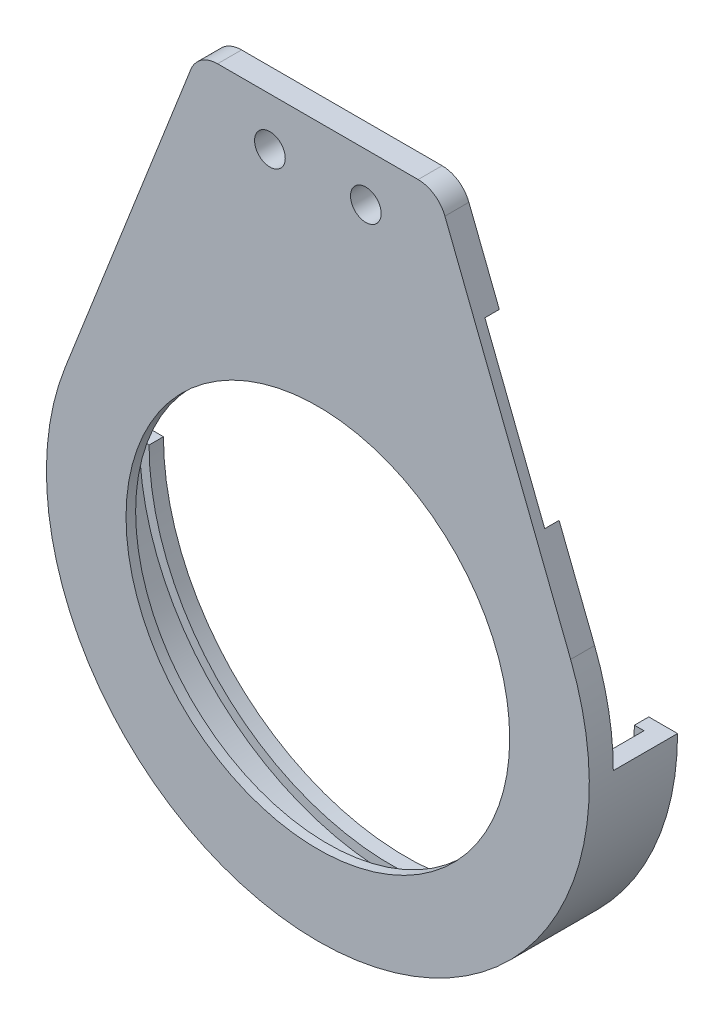
ISO-10303-21;
HEADER;
FILE_DESCRIPTION(('STEP AP214'),'2;1');
FILE_NAME('part.step','',(''),(''),'','','');
FILE_SCHEMA(('AUTOMOTIVE_DESIGN { 1 0 10303 214 1 1 1 1 }'));
ENDSEC;
DATA;
#1=APPLICATION_CONTEXT('core data for automotive mechanical design processes');
#2=APPLICATION_PROTOCOL_DEFINITION('international standard','automotive_design',2000,#1);
#3=PRODUCT_CONTEXT('',#1,'mechanical');
#4=PRODUCT('Part','Part','',(#3));
#5=PRODUCT_RELATED_PRODUCT_CATEGORY('part','',(#4));
#6=PRODUCT_DEFINITION_FORMATION('','',#4);
#7=PRODUCT_DEFINITION_CONTEXT('part definition',#1,'design');
#8=PRODUCT_DEFINITION('design','',#6,#7);
#9=PRODUCT_DEFINITION_SHAPE('','',#8);
#10=(LENGTH_UNIT() NAMED_UNIT(*) SI_UNIT(.MILLI.,.METRE.));
#11=(NAMED_UNIT(*) PLANE_ANGLE_UNIT() SI_UNIT($,.RADIAN.));
#12=(NAMED_UNIT(*) SI_UNIT($,.STERADIAN.) SOLID_ANGLE_UNIT());
#13=UNCERTAINTY_MEASURE_WITH_UNIT(LENGTH_MEASURE(1.E-05),#10,'distance_accuracy_value','');
#14=(GEOMETRIC_REPRESENTATION_CONTEXT(3) GLOBAL_UNCERTAINTY_ASSIGNED_CONTEXT((#13)) GLOBAL_UNIT_ASSIGNED_CONTEXT((#10,
#11,#12)) REPRESENTATION_CONTEXT('',''));
#15=CARTESIAN_POINT('',(0.,0.,0.));
#16=DIRECTION('',(0.,0.,1.));
#17=DIRECTION('',(1.,0.,0.));
#18=AXIS2_PLACEMENT_3D('',#15,#16,#17);
#19=CARTESIAN_POINT('',(0.,0.,0.));
#20=DIRECTION('',(0.,0.,1.));
#21=DIRECTION('',(1.,0.,0.));
#22=AXIS2_PLACEMENT_3D('',#19,#20,#21);
#23=PLANE('',#22);
#24=DIRECTION('',(-0.364610341829542,-0.931160189565117,0.));
#25=VECTOR('',#24,1.);
#26=CARTESIAN_POINT('',(-26.3518333646928,10.318472673776,0.));
#27=LINE('',#26,#25);
#28=CARTESIAN_POINT('',(-22.65,19.7724005034407,0.));
#29=VERTEX_POINT('',#28);
#30=CARTESIAN_POINT('',(-26.3518333646928,10.318472673776,0.));
#31=VERTEX_POINT('',#30);
#32=EDGE_CURVE('E281',#29,#31,#27,.T.);
#33=ORIENTED_EDGE('',*,*,#32,.F.);
#34=DIRECTION('',(0.,-1.,0.));
#35=VECTOR('',#34,1.);
#36=CARTESIAN_POINT('',(-22.65,0.,0.));
#37=LINE('',#36,#35);
#38=CARTESIAN_POINT('',(-22.65,0.,0.));
#39=VERTEX_POINT('',#38);
#40=EDGE_CURVE('E211',#29,#39,#37,.T.);
#41=ORIENTED_EDGE('',*,*,#40,.T.);
#42=CARTESIAN_POINT('',(0.,0.,0.));
#43=DIRECTION('',(0.,0.,1.));
#44=DIRECTION('',(1.,0.,0.));
#45=AXIS2_PLACEMENT_3D('',#42,#43,#44);
#46=CIRCLE('',#45,22.65);
#47=CARTESIAN_POINT('',(22.65,0.,0.));
#48=VERTEX_POINT('',#47);
#49=EDGE_CURVE('E315',#39,#48,#46,.T.);
#50=ORIENTED_EDGE('',*,*,#49,.T.);
#51=DIRECTION('',(0.,1.,0.));
#52=VECTOR('',#51,1.);
#53=CARTESIAN_POINT('',(22.65,0.,0.));
#54=LINE('',#53,#52);
#55=CARTESIAN_POINT('',(22.65,19.7724005034407,0.));
#56=VERTEX_POINT('',#55);
#57=EDGE_CURVE('E186',#48,#56,#54,.T.);
#58=ORIENTED_EDGE('',*,*,#57,.T.);
#59=DIRECTION('',(-0.364610341829542,0.931160189565117,0.));
#60=VECTOR('',#59,1.);
#61=CARTESIAN_POINT('',(26.3518333646928,10.318472673776,0.));
#62=LINE('',#61,#60);
#63=CARTESIAN_POINT('',(26.3518333646928,10.318472673776,0.));
#64=VERTEX_POINT('',#63);
#65=EDGE_CURVE('E274',#64,#56,#62,.T.);
#66=ORIENTED_EDGE('',*,*,#65,.F.);
#67=CARTESIAN_POINT('',(0.,0.,0.));
#68=DIRECTION('',(0.,0.,1.));
#69=DIRECTION('',(1.,0.,0.));
#70=AXIS2_PLACEMENT_3D('',#67,#68,#69);
#71=CIRCLE('',#70,28.3);
#72=CARTESIAN_POINT('',(28.3,0.,0.));
#73=VERTEX_POINT('',#72);
#74=EDGE_CURVE('E300',#73,#64,#71,.T.);
#75=ORIENTED_EDGE('',*,*,#74,.F.);
#76=DIRECTION('',(1.,0.,0.));
#77=VECTOR('',#76,1.);
#78=CARTESIAN_POINT('',(28.3,0.,0.));
#79=LINE('',#78,#77);
#80=CARTESIAN_POINT('',(26.3,0.,0.));
#81=VERTEX_POINT('',#80);
#82=EDGE_CURVE('E242',#81,#73,#79,.T.);
#83=ORIENTED_EDGE('',*,*,#82,.F.);
#84=CARTESIAN_POINT('',(0.,0.,0.));
#85=DIRECTION('',(0.,0.,1.));
#86=DIRECTION('',(-1.,0.,0.));
#87=AXIS2_PLACEMENT_3D('',#84,#85,#86);
#88=CIRCLE('',#87,26.3);
#89=CARTESIAN_POINT('',(-26.3,0.,0.));
#90=VERTEX_POINT('',#89);
#91=EDGE_CURVE('E245',#90,#81,#88,.T.);
#92=ORIENTED_EDGE('',*,*,#91,.F.);
#93=DIRECTION('',(1.,0.,0.));
#94=VECTOR('',#93,1.);
#95=CARTESIAN_POINT('',(-28.3,0.,0.));
#96=LINE('',#95,#94);
#97=CARTESIAN_POINT('',(-28.3,0.,0.));
#98=VERTEX_POINT('',#97);
#99=EDGE_CURVE('E237',#98,#90,#96,.T.);
#100=ORIENTED_EDGE('',*,*,#99,.F.);
#101=EDGE_CURVE('E304',#31,#98,#71,.T.);
#102=ORIENTED_EDGE('',*,*,#101,.F.);
#103=EDGE_LOOP('',(#33,#41,#50,#58,#66,#75,#83,#92,#100,#102));
#104=FACE_BOUND('',#103,.T.);
#105=ADVANCED_FACE('F42',(#104),#23,.F.);
#106=CARTESIAN_POINT('',(0.,0.,2.5));
#107=DIRECTION('',(0.,0.,-1.));
#108=DIRECTION('',(-1.,0.,0.));
#109=AXIS2_PLACEMENT_3D('',#106,#107,#108);
#110=CYLINDRICAL_SURFACE('',#109,20.);
#111=CARTESIAN_POINT('',(0.,0.,2.5));
#112=DIRECTION('',(0.,0.,1.));
#113=DIRECTION('',(1.,0.,0.));
#114=AXIS2_PLACEMENT_3D('',#111,#112,#113);
#115=CIRCLE('',#114,20.);
#116=CARTESIAN_POINT('',(20.,0.,2.5));
#117=VERTEX_POINT('',#116);
#118=EDGE_CURVE('E295',#117,#117,#115,.T.);
#119=ORIENTED_EDGE('',*,*,#118,.T.);
#120=EDGE_LOOP('',(#119));
#121=FACE_BOUND('',#120,.T.);
#122=CARTESIAN_POINT('',(0.,0.,1.5));
#123=DIRECTION('',(0.,0.,-1.));
#124=DIRECTION('',(-1.,0.,0.));
#125=AXIS2_PLACEMENT_3D('',#122,#123,#124);
#126=CIRCLE('',#125,20.);
#127=CARTESIAN_POINT('',(-20.,0.,1.5));
#128=VERTEX_POINT('',#127);
#129=EDGE_CURVE('E201',#128,#128,#126,.T.);
#130=ORIENTED_EDGE('',*,*,#129,.T.);
#131=EDGE_LOOP('',(#130));
#132=FACE_BOUND('',#131,.T.);
#133=ADVANCED_FACE('F359',(#121,#132),#110,.F.);
#134=CARTESIAN_POINT('',(-5.,40.6939798987516,0.));
#135=DIRECTION('',(0.,0.,1.));
#136=DIRECTION('',(1.,0.,0.));
#137=AXIS2_PLACEMENT_3D('',#134,#135,#136);
#138=CIRCLE('',#137,1.6);
#139=CARTESIAN_POINT('',(-3.4,40.6939798987516,0.));
#140=VERTEX_POINT('',#139);
#141=EDGE_CURVE('E268',#140,#140,#138,.T.);
#142=ORIENTED_EDGE('',*,*,#141,.T.);
#143=EDGE_LOOP('',(#142));
#144=FACE_BOUND('',#143,.T.);
#145=CARTESIAN_POINT('',(5.,40.6939798987516,0.));
#146=DIRECTION('',(0.,0.,1.));
#147=DIRECTION('',(-1.,0.,0.));
#148=AXIS2_PLACEMENT_3D('',#145,#146,#147);
#149=CIRCLE('',#148,1.59999999999999);
#150=CARTESIAN_POINT('',(3.40000000000001,40.6939798987516,0.));
#151=VERTEX_POINT('',#150);
#152=EDGE_CURVE('E262',#151,#151,#149,.T.);
#153=ORIENTED_EDGE('',*,*,#152,.T.);
#154=EDGE_LOOP('',(#153));
#155=FACE_BOUND('',#154,.T.);
#156=CARTESIAN_POINT('',(-13.2463902872674,43.7878109242402,0.));
#157=VERTEX_POINT('',#156);
#158=CARTESIAN_POINT('',(-16.4156564672275,35.6939798987516,0.));
#159=VERTEX_POINT('',#158);
#160=EDGE_CURVE('E282',#157,#159,#27,.T.);
#161=ORIENTED_EDGE('',*,*,#160,.F.);
#162=CARTESIAN_POINT('',(-10.452909718572,42.6939798987516,0.));
#163=DIRECTION('',(0.,0.,1.));
#164=DIRECTION('',(1.,0.,0.));
#165=AXIS2_PLACEMENT_3D('',#162,#163,#164);
#166=CIRCLE('',#165,3.);
#167=CARTESIAN_POINT('',(-10.452909718572,45.6939798987516,0.));
#168=VERTEX_POINT('',#167);
#169=EDGE_CURVE('E50',#157,#168,#166,.F.);
#170=ORIENTED_EDGE('',*,*,#169,.T.);
#171=DIRECTION('',(-1.,0.,0.));
#172=VECTOR('',#171,1.);
#173=CARTESIAN_POINT('',(-12.5,45.6939798987516,0.));
#174=LINE('',#173,#172);
#175=CARTESIAN_POINT('',(10.452909718572,45.6939798987516,0.));
#176=VERTEX_POINT('',#175);
#177=EDGE_CURVE('E277',#176,#168,#174,.T.);
#178=ORIENTED_EDGE('',*,*,#177,.F.);
#179=CARTESIAN_POINT('',(10.452909718572,42.6939798987516,0.));
#180=DIRECTION('',(0.,0.,1.));
#181=DIRECTION('',(1.,0.,0.));
#182=AXIS2_PLACEMENT_3D('',#179,#180,#181);
#183=CIRCLE('',#182,3.);
#184=CARTESIAN_POINT('',(13.2463902872674,43.7878109242402,0.));
#185=VERTEX_POINT('',#184);
#186=EDGE_CURVE('E57',#176,#185,#183,.F.);
#187=ORIENTED_EDGE('',*,*,#186,.T.);
#188=CARTESIAN_POINT('',(16.4156564672275,35.6939798987516,0.));
#189=VERTEX_POINT('',#188);
#190=EDGE_CURVE('E278',#189,#185,#62,.T.);
#191=ORIENTED_EDGE('',*,*,#190,.F.);
#192=DIRECTION('',(-1.,0.,0.));
#193=VECTOR('',#192,1.);
#194=CARTESIAN_POINT('',(0.,35.6939798987516,0.));
#195=LINE('',#194,#193);
#196=EDGE_CURVE('E204',#189,#159,#195,.T.);
#197=ORIENTED_EDGE('',*,*,#196,.T.);
#198=EDGE_LOOP('',(#161,#170,#178,#187,#191,#197));
#199=FACE_BOUND('',#198,.T.);
#200=ADVANCED_FACE('F328',(#144,#155,#199),#23,.F.);
#201=CARTESIAN_POINT('',(0.,0.,2.5));
#202=DIRECTION('',(0.,0.,1.));
#203=DIRECTION('',(1.,0.,0.));
#204=AXIS2_PLACEMENT_3D('',#201,#202,#203);
#205=PLANE('',#204);
#206=DIRECTION('',(-1.,0.,0.));
#207=VECTOR('',#206,1.);
#208=CARTESIAN_POINT('',(-12.5,45.6939798987516,2.5));
#209=LINE('',#208,#207);
#210=CARTESIAN_POINT('',(10.452909718572,45.6939798987516,2.5));
#211=VERTEX_POINT('',#210);
#212=CARTESIAN_POINT('',(-10.452909718572,45.6939798987516,2.5));
#213=VERTEX_POINT('',#212);
#214=EDGE_CURVE('E287',#211,#213,#209,.T.);
#215=ORIENTED_EDGE('',*,*,#214,.T.);
#216=CARTESIAN_POINT('',(-10.452909718572,42.6939798987516,2.5));
#217=DIRECTION('',(0.,0.,1.));
#218=DIRECTION('',(1.,0.,0.));
#219=AXIS2_PLACEMENT_3D('',#216,#217,#218);
#220=CIRCLE('',#219,3.);
#221=CARTESIAN_POINT('',(-13.2463902872674,43.7878109242402,2.5));
#222=VERTEX_POINT('',#221);
#223=EDGE_CURVE('E324',#213,#222,#220,.T.);
#224=ORIENTED_EDGE('',*,*,#223,.T.);
#225=DIRECTION('',(-0.364610341829542,-0.931160189565117,0.));
#226=VECTOR('',#225,1.);
#227=CARTESIAN_POINT('',(-26.3518333646928,10.318472673776,2.5));
#228=LINE('',#227,#226);
#229=CARTESIAN_POINT('',(-26.3518333646928,10.318472673776,2.5));
#230=VERTEX_POINT('',#229);
#231=EDGE_CURVE('E290',#222,#230,#228,.T.);
#232=ORIENTED_EDGE('',*,*,#231,.T.);
#233=CARTESIAN_POINT('',(0.,0.,2.5));
#234=DIRECTION('',(0.,0.,1.));
#235=DIRECTION('',(1.,0.,0.));
#236=AXIS2_PLACEMENT_3D('',#233,#234,#235);
#237=CIRCLE('',#236,28.3);
#238=CARTESIAN_POINT('',(26.3518333646928,10.318472673776,2.5));
#239=VERTEX_POINT('',#238);
#240=EDGE_CURVE('E301',#230,#239,#237,.T.);
#241=ORIENTED_EDGE('',*,*,#240,.T.);
#242=DIRECTION('',(-0.364610341829542,0.931160189565117,0.));
#243=VECTOR('',#242,1.);
#244=CARTESIAN_POINT('',(26.3518333646928,10.318472673776,2.5));
#245=LINE('',#244,#243);
#246=CARTESIAN_POINT('',(13.2463902872674,43.7878109242402,2.5));
#247=VERTEX_POINT('',#246);
#248=EDGE_CURVE('E271',#239,#247,#245,.T.);
#249=ORIENTED_EDGE('',*,*,#248,.T.);
#250=CARTESIAN_POINT('',(10.452909718572,42.6939798987516,2.5));
#251=DIRECTION('',(0.,0.,1.));
#252=DIRECTION('',(1.,0.,0.));
#253=AXIS2_PLACEMENT_3D('',#250,#251,#252);
#254=CIRCLE('',#253,3.);
#255=EDGE_CURVE('E322',#247,#211,#254,.T.);
#256=ORIENTED_EDGE('',*,*,#255,.T.);
#257=EDGE_LOOP('',(#215,#224,#232,#241,#249,#256));
#258=FACE_BOUND('',#257,.T.);
#259=ORIENTED_EDGE('',*,*,#118,.F.);
#260=EDGE_LOOP('',(#259));
#261=FACE_BOUND('',#260,.T.);
#262=CARTESIAN_POINT('',(5.,40.6939798987516,2.5));
#263=DIRECTION('',(0.,0.,1.));
#264=DIRECTION('',(-1.,0.,0.));
#265=AXIS2_PLACEMENT_3D('',#262,#263,#264);
#266=CIRCLE('',#265,1.59999999999999);
#267=CARTESIAN_POINT('',(3.40000000000001,40.6939798987516,2.5));
#268=VERTEX_POINT('',#267);
#269=EDGE_CURVE('E261',#268,#268,#266,.T.);
#270=ORIENTED_EDGE('',*,*,#269,.F.);
#271=EDGE_LOOP('',(#270));
#272=FACE_BOUND('',#271,.T.);
#273=CARTESIAN_POINT('',(-5.,40.6939798987516,2.5));
#274=DIRECTION('',(0.,0.,1.));
#275=DIRECTION('',(1.,0.,0.));
#276=AXIS2_PLACEMENT_3D('',#273,#274,#275);
#277=CIRCLE('',#276,1.6);
#278=CARTESIAN_POINT('',(-3.4,40.6939798987516,2.5));
#279=VERTEX_POINT('',#278);
#280=EDGE_CURVE('E265',#279,#279,#277,.T.);
#281=ORIENTED_EDGE('',*,*,#280,.F.);
#282=EDGE_LOOP('',(#281));
#283=FACE_BOUND('',#282,.T.);
#284=ADVANCED_FACE('F337',(#258,#261,#272,#283),#205,.T.);
#285=CARTESIAN_POINT('',(0.,0.,2.5));
#286=DIRECTION('',(0.,0.,-1.));
#287=DIRECTION('',(-1.,0.,0.));
#288=AXIS2_PLACEMENT_3D('',#285,#286,#287);
#289=CYLINDRICAL_SURFACE('',#288,28.3);
#290=ORIENTED_EDGE('',*,*,#240,.F.);
#291=DIRECTION('',(0.,0.,1.));
#292=VECTOR('',#291,1.);
#293=CARTESIAN_POINT('',(-26.3518333646928,10.318472673776,0.));
#294=LINE('',#293,#292);
#295=EDGE_CURVE('E292',#31,#230,#294,.T.);
#296=ORIENTED_EDGE('',*,*,#295,.F.);
#297=ORIENTED_EDGE('',*,*,#101,.T.);
#298=DIRECTION('',(0.,0.,1.));
#299=VECTOR('',#298,1.);
#300=CARTESIAN_POINT('',(-28.3,0.,-5.2));
#301=LINE('',#300,#299);
#302=CARTESIAN_POINT('',(-28.3,0.,-6.7));
#303=VERTEX_POINT('',#302);
#304=EDGE_CURVE('E258',#303,#98,#301,.T.);
#305=ORIENTED_EDGE('',*,*,#304,.F.);
#306=CARTESIAN_POINT('',(0.,0.,-6.7));
#307=DIRECTION('',(0.,0.,-1.));
#308=DIRECTION('',(-1.,0.,0.));
#309=AXIS2_PLACEMENT_3D('',#306,#307,#308);
#310=CIRCLE('',#309,28.3);
#311=CARTESIAN_POINT('',(28.3,0.,-6.7));
#312=VERTEX_POINT('',#311);
#313=EDGE_CURVE('E215',#312,#303,#310,.T.);
#314=ORIENTED_EDGE('',*,*,#313,.F.);
#315=DIRECTION('',(0.,0.,1.));
#316=VECTOR('',#315,1.);
#317=CARTESIAN_POINT('',(28.3,0.,-5.2));
#318=LINE('',#317,#316);
#319=EDGE_CURVE('E241',#312,#73,#318,.T.);
#320=ORIENTED_EDGE('',*,*,#319,.T.);
#321=ORIENTED_EDGE('',*,*,#74,.T.);
#322=DIRECTION('',(0.,0.,1.));
#323=VECTOR('',#322,1.);
#324=CARTESIAN_POINT('',(26.3518333646928,10.318472673776,0.));
#325=LINE('',#324,#323);
#326=EDGE_CURVE('E284',#64,#239,#325,.T.);
#327=ORIENTED_EDGE('',*,*,#326,.T.);
#328=EDGE_LOOP('',(#290,#296,#297,#305,#314,#320,#321,#327));
#329=FACE_BOUND('',#328,.T.);
#330=ADVANCED_FACE('F346',(#329),#289,.T.);
#331=CARTESIAN_POINT('',(-26.3518333646928,10.318472673776,0.));
#332=DIRECTION('',(-0.931160189565117,0.364610341829542,0.));
#333=DIRECTION('',(-0.364610341829542,-0.931160189565117,0.));
#334=AXIS2_PLACEMENT_3D('',#331,#332,#333);
#335=PLANE('',#334);
#336=ORIENTED_EDGE('',*,*,#231,.F.);
#337=DIRECTION('',(0.,0.,1.));
#338=VECTOR('',#337,1.);
#339=CARTESIAN_POINT('',(-13.2463902872674,43.7878109242402,0.));
#340=LINE('',#339,#338);
#341=EDGE_CURVE('E65',#222,#157,#340,.F.);
#342=ORIENTED_EDGE('',*,*,#341,.T.);
#343=ORIENTED_EDGE('',*,*,#160,.T.);
#344=DIRECTION('',(0.,0.,-1.));
#345=VECTOR('',#344,1.);
#346=CARTESIAN_POINT('',(-16.4156564672275,35.6939798987516,0.));
#347=LINE('',#346,#345);
#348=CARTESIAN_POINT('',(-16.4156564672275,35.6939798987516,1.5));
#349=VERTEX_POINT('',#348);
#350=EDGE_CURVE('E207',#349,#159,#347,.T.);
#351=ORIENTED_EDGE('',*,*,#350,.F.);
#352=DIRECTION('',(-0.364610341829542,-0.931160189565117,0.));
#353=VECTOR('',#352,1.);
#354=CARTESIAN_POINT('',(-26.3518333646928,10.318472673776,1.5));
#355=LINE('',#354,#353);
#356=CARTESIAN_POINT('',(-22.65,19.7724005034407,1.5));
#357=VERTEX_POINT('',#356);
#358=EDGE_CURVE('E197',#349,#357,#355,.T.);
#359=ORIENTED_EDGE('',*,*,#358,.T.);
#360=DIRECTION('',(0.,0.,1.));
#361=VECTOR('',#360,1.);
#362=CARTESIAN_POINT('',(-22.65,19.7724005034407,0.));
#363=LINE('',#362,#361);
#364=EDGE_CURVE('E313',#29,#357,#363,.T.);
#365=ORIENTED_EDGE('',*,*,#364,.F.);
#366=ORIENTED_EDGE('',*,*,#32,.T.);
#367=ORIENTED_EDGE('',*,*,#295,.T.);
#368=EDGE_LOOP('',(#336,#342,#343,#351,#359,#365,#366,#367));
#369=FACE_BOUND('',#368,.T.);
#370=ADVANCED_FACE('F339',(#369),#335,.T.);
#371=CARTESIAN_POINT('',(-12.5,45.6939798987516,0.));
#372=DIRECTION('',(0.,1.,0.));
#373=DIRECTION('',(0.,0.,1.));
#374=AXIS2_PLACEMENT_3D('',#371,#372,#373);
#375=PLANE('',#374);
#376=ORIENTED_EDGE('',*,*,#177,.T.);
#377=DIRECTION('',(0.,0.,1.));
#378=VECTOR('',#377,1.);
#379=CARTESIAN_POINT('',(-10.452909718572,45.6939798987516,0.));
#380=LINE('',#379,#378);
#381=EDGE_CURVE('E319',#168,#213,#380,.T.);
#382=ORIENTED_EDGE('',*,*,#381,.T.);
#383=ORIENTED_EDGE('',*,*,#214,.F.);
#384=DIRECTION('',(0.,0.,1.));
#385=VECTOR('',#384,1.);
#386=CARTESIAN_POINT('',(10.452909718572,45.6939798987516,0.));
#387=LINE('',#386,#385);
#388=EDGE_CURVE('E317',#211,#176,#387,.F.);
#389=ORIENTED_EDGE('',*,*,#388,.T.);
#390=EDGE_LOOP('',(#376,#382,#383,#389));
#391=FACE_BOUND('',#390,.T.);
#392=ADVANCED_FACE('F332',(#391),#375,.T.);
#393=CARTESIAN_POINT('',(26.3518333646928,10.318472673776,0.));
#394=DIRECTION('',(0.931160189565117,0.364610341829542,0.));
#395=DIRECTION('',(-0.364610341829542,0.931160189565117,0.));
#396=AXIS2_PLACEMENT_3D('',#393,#394,#395);
#397=PLANE('',#396);
#398=ORIENTED_EDGE('',*,*,#190,.T.);
#399=DIRECTION('',(0.,0.,1.));
#400=VECTOR('',#399,1.);
#401=CARTESIAN_POINT('',(13.2463902872674,43.7878109242402,0.));
#402=LINE('',#401,#400);
#403=EDGE_CURVE('E11',#185,#247,#402,.T.);
#404=ORIENTED_EDGE('',*,*,#403,.T.);
#405=ORIENTED_EDGE('',*,*,#248,.F.);
#406=ORIENTED_EDGE('',*,*,#326,.F.);
#407=ORIENTED_EDGE('',*,*,#65,.T.);
#408=DIRECTION('',(0.,0.,-1.));
#409=VECTOR('',#408,1.);
#410=CARTESIAN_POINT('',(22.65,19.7724005034407,0.));
#411=LINE('',#410,#409);
#412=CARTESIAN_POINT('',(22.65,19.7724005034407,1.5));
#413=VERTEX_POINT('',#412);
#414=EDGE_CURVE('E311',#413,#56,#411,.T.);
#415=ORIENTED_EDGE('',*,*,#414,.F.);
#416=DIRECTION('',(-0.364610341829542,0.931160189565117,0.));
#417=VECTOR('',#416,1.);
#418=CARTESIAN_POINT('',(26.3518333646928,10.318472673776,1.5));
#419=LINE('',#418,#417);
#420=CARTESIAN_POINT('',(16.4156564672275,35.6939798987516,1.5));
#421=VERTEX_POINT('',#420);
#422=EDGE_CURVE('E177',#413,#421,#419,.T.);
#423=ORIENTED_EDGE('',*,*,#422,.T.);
#424=DIRECTION('',(0.,0.,1.));
#425=VECTOR('',#424,1.);
#426=CARTESIAN_POINT('',(16.4156564672275,35.6939798987516,0.));
#427=LINE('',#426,#425);
#428=EDGE_CURVE('E308',#189,#421,#427,.T.);
#429=ORIENTED_EDGE('',*,*,#428,.F.);
#430=EDGE_LOOP('',(#398,#404,#405,#406,#407,#415,#423,#429));
#431=FACE_BOUND('',#430,.T.);
#432=ADVANCED_FACE('F349',(#431),#397,.T.);
#433=CARTESIAN_POINT('',(-5.,40.6939798987516,0.));
#434=DIRECTION('',(0.,0.,1.));
#435=DIRECTION('',(1.,0.,0.));
#436=AXIS2_PLACEMENT_3D('',#433,#434,#435);
#437=CYLINDRICAL_SURFACE('',#436,1.6);
#438=ORIENTED_EDGE('',*,*,#141,.F.);
#439=EDGE_LOOP('',(#438));
#440=FACE_BOUND('',#439,.T.);
#441=ORIENTED_EDGE('',*,*,#280,.T.);
#442=EDGE_LOOP('',(#441));
#443=FACE_BOUND('',#442,.T.);
#444=ADVANCED_FACE('F384',(#440,#443),#437,.F.);
#445=CARTESIAN_POINT('',(5.,40.6939798987516,0.));
#446=DIRECTION('',(0.,0.,1.));
#447=DIRECTION('',(1.,0.,0.));
#448=AXIS2_PLACEMENT_3D('',#445,#446,#447);
#449=CYLINDRICAL_SURFACE('',#448,1.59999999999999);
#450=ORIENTED_EDGE('',*,*,#152,.F.);
#451=EDGE_LOOP('',(#450));
#452=FACE_BOUND('',#451,.T.);
#453=ORIENTED_EDGE('',*,*,#269,.T.);
#454=EDGE_LOOP('',(#453));
#455=FACE_BOUND('',#454,.T.);
#456=ADVANCED_FACE('F380',(#452,#455),#449,.F.);
#457=CARTESIAN_POINT('',(-28.3,0.,-5.2));
#458=DIRECTION('',(0.,-1.,0.));
#459=DIRECTION('',(0.,0.,-1.));
#460=AXIS2_PLACEMENT_3D('',#457,#458,#459);
#461=PLANE('',#460);
#462=ORIENTED_EDGE('',*,*,#99,.T.);
#463=DIRECTION('',(0.,0.,1.));
#464=VECTOR('',#463,1.);
#465=CARTESIAN_POINT('',(-26.3,0.,-5.2));
#466=LINE('',#465,#464);
#467=CARTESIAN_POINT('',(-26.3,0.,-5.2));
#468=VERTEX_POINT('',#467);
#469=EDGE_CURVE('E255',#468,#90,#466,.T.);
#470=ORIENTED_EDGE('',*,*,#469,.F.);
#471=DIRECTION('',(1.,0.,0.));
#472=VECTOR('',#471,1.);
#473=CARTESIAN_POINT('',(-25.3,0.,-5.2));
#474=LINE('',#473,#472);
#475=CARTESIAN_POINT('',(-25.3,0.,-5.2));
#476=VERTEX_POINT('',#475);
#477=EDGE_CURVE('E214',#468,#476,#474,.T.);
#478=ORIENTED_EDGE('',*,*,#477,.T.);
#479=DIRECTION('',(0.,0.,1.));
#480=VECTOR('',#479,1.);
#481=CARTESIAN_POINT('',(-25.3,0.,-6.7));
#482=LINE('',#481,#480);
#483=CARTESIAN_POINT('',(-25.3,0.,-6.7));
#484=VERTEX_POINT('',#483);
#485=EDGE_CURVE('E234',#484,#476,#482,.T.);
#486=ORIENTED_EDGE('',*,*,#485,.F.);
#487=DIRECTION('',(1.,0.,0.));
#488=VECTOR('',#487,1.);
#489=CARTESIAN_POINT('',(-25.3,0.,-6.7));
#490=LINE('',#489,#488);
#491=EDGE_CURVE('E218',#303,#484,#490,.T.);
#492=ORIENTED_EDGE('',*,*,#491,.F.);
#493=ORIENTED_EDGE('',*,*,#304,.T.);
#494=EDGE_LOOP('',(#462,#470,#478,#486,#492,#493));
#495=FACE_BOUND('',#494,.T.);
#496=ADVANCED_FACE('F383',(#495),#461,.F.);
#497=CARTESIAN_POINT('',(0.,0.,-5.2));
#498=DIRECTION('',(0.,0.,1.));
#499=DIRECTION('',(1.,0.,0.));
#500=AXIS2_PLACEMENT_3D('',#497,#498,#499);
#501=CYLINDRICAL_SURFACE('',#500,26.3);
#502=ORIENTED_EDGE('',*,*,#91,.T.);
#503=DIRECTION('',(0.,0.,1.));
#504=VECTOR('',#503,1.);
#505=CARTESIAN_POINT('',(26.3,0.,-5.2));
#506=LINE('',#505,#504);
#507=CARTESIAN_POINT('',(26.3,0.,-5.2));
#508=VERTEX_POINT('',#507);
#509=EDGE_CURVE('E252',#508,#81,#506,.T.);
#510=ORIENTED_EDGE('',*,*,#509,.F.);
#511=CARTESIAN_POINT('',(0.,0.,-5.2));
#512=DIRECTION('',(0.,0.,1.));
#513=DIRECTION('',(-1.,0.,0.));
#514=AXIS2_PLACEMENT_3D('',#511,#512,#513);
#515=CIRCLE('',#514,26.3);
#516=EDGE_CURVE('E238',#468,#508,#515,.T.);
#517=ORIENTED_EDGE('',*,*,#516,.F.);
#518=ORIENTED_EDGE('',*,*,#469,.T.);
#519=EDGE_LOOP('',(#502,#510,#517,#518));
#520=FACE_BOUND('',#519,.T.);
#521=ADVANCED_FACE('F518',(#520),#501,.F.);
#522=CARTESIAN_POINT('',(28.3,0.,-5.2));
#523=DIRECTION('',(0.,-1.,0.));
#524=DIRECTION('',(0.,0.,-1.));
#525=AXIS2_PLACEMENT_3D('',#522,#523,#524);
#526=PLANE('',#525);
#527=ORIENTED_EDGE('',*,*,#82,.T.);
#528=ORIENTED_EDGE('',*,*,#319,.F.);
#529=DIRECTION('',(1.,0.,0.));
#530=VECTOR('',#529,1.);
#531=CARTESIAN_POINT('',(28.3,0.,-6.7));
#532=LINE('',#531,#530);
#533=CARTESIAN_POINT('',(25.3,0.,-6.7));
#534=VERTEX_POINT('',#533);
#535=EDGE_CURVE('E223',#534,#312,#532,.T.);
#536=ORIENTED_EDGE('',*,*,#535,.F.);
#537=DIRECTION('',(0.,0.,1.));
#538=VECTOR('',#537,1.);
#539=CARTESIAN_POINT('',(25.3,0.,-6.7));
#540=LINE('',#539,#538);
#541=CARTESIAN_POINT('',(25.3,0.,-5.2));
#542=VERTEX_POINT('',#541);
#543=EDGE_CURVE('E226',#534,#542,#540,.T.);
#544=ORIENTED_EDGE('',*,*,#543,.T.);
#545=DIRECTION('',(1.,0.,0.));
#546=VECTOR('',#545,1.);
#547=CARTESIAN_POINT('',(28.3,0.,-5.2));
#548=LINE('',#547,#546);
#549=EDGE_CURVE('E219',#542,#508,#548,.T.);
#550=ORIENTED_EDGE('',*,*,#549,.T.);
#551=ORIENTED_EDGE('',*,*,#509,.T.);
#552=EDGE_LOOP('',(#527,#528,#536,#544,#550,#551));
#553=FACE_BOUND('',#552,.T.);
#554=ADVANCED_FACE('F507',(#553),#526,.F.);
#555=CARTESIAN_POINT('',(0.,0.,-5.2));
#556=DIRECTION('',(0.,0.,-1.));
#557=DIRECTION('',(-1.,0.,0.));
#558=AXIS2_PLACEMENT_3D('',#555,#556,#557);
#559=PLANE('',#558);
#560=ORIENTED_EDGE('',*,*,#477,.F.);
#561=ORIENTED_EDGE('',*,*,#516,.T.);
#562=ORIENTED_EDGE('',*,*,#549,.F.);
#563=CARTESIAN_POINT('',(0.,0.,-5.2));
#564=DIRECTION('',(0.,0.,1.));
#565=DIRECTION('',(-1.,0.,0.));
#566=AXIS2_PLACEMENT_3D('',#563,#564,#565);
#567=CIRCLE('',#566,25.3);
#568=EDGE_CURVE('E228',#476,#542,#567,.T.);
#569=ORIENTED_EDGE('',*,*,#568,.F.);
#570=EDGE_LOOP('',(#560,#561,#562,#569));
#571=FACE_BOUND('',#570,.T.);
#572=ADVANCED_FACE('F497',(#571),#559,.F.);
#573=CARTESIAN_POINT('',(0.,0.,-6.7));
#574=DIRECTION('',(0.,0.,1.));
#575=DIRECTION('',(1.,0.,0.));
#576=AXIS2_PLACEMENT_3D('',#573,#574,#575);
#577=CYLINDRICAL_SURFACE('',#576,25.3);
#578=ORIENTED_EDGE('',*,*,#568,.T.);
#579=ORIENTED_EDGE('',*,*,#543,.F.);
#580=CARTESIAN_POINT('',(0.,0.,-6.7));
#581=DIRECTION('',(0.,0.,1.));
#582=DIRECTION('',(-1.,0.,0.));
#583=AXIS2_PLACEMENT_3D('',#580,#581,#582);
#584=CIRCLE('',#583,25.3);
#585=EDGE_CURVE('E221',#484,#534,#584,.T.);
#586=ORIENTED_EDGE('',*,*,#585,.F.);
#587=ORIENTED_EDGE('',*,*,#485,.T.);
#588=EDGE_LOOP('',(#578,#579,#586,#587));
#589=FACE_BOUND('',#588,.T.);
#590=ADVANCED_FACE('F487',(#589),#577,.F.);
#591=CARTESIAN_POINT('',(0.,0.,-6.7));
#592=DIRECTION('',(0.,0.,-1.));
#593=DIRECTION('',(-1.,0.,0.));
#594=AXIS2_PLACEMENT_3D('',#591,#592,#593);
#595=PLANE('',#594);
#596=ORIENTED_EDGE('',*,*,#313,.T.);
#597=ORIENTED_EDGE('',*,*,#491,.T.);
#598=ORIENTED_EDGE('',*,*,#585,.T.);
#599=ORIENTED_EDGE('',*,*,#535,.T.);
#600=EDGE_LOOP('',(#596,#597,#598,#599));
#601=FACE_BOUND('',#600,.T.);
#602=ADVANCED_FACE('F466',(#601),#595,.T.);
#603=CARTESIAN_POINT('',(0.,0.,1.5));
#604=DIRECTION('',(0.,0.,-1.));
#605=DIRECTION('',(-1.,0.,0.));
#606=AXIS2_PLACEMENT_3D('',#603,#604,#605);
#607=CYLINDRICAL_SURFACE('',#606,22.65);
#608=DIRECTION('',(0.,0.,-1.));
#609=VECTOR('',#608,1.);
#610=CARTESIAN_POINT('',(-22.65,0.,1.5));
#611=LINE('',#610,#609);
#612=CARTESIAN_POINT('',(-22.65,0.,1.5));
#613=VERTEX_POINT('',#612);
#614=EDGE_CURVE('E189',#613,#39,#611,.T.);
#615=ORIENTED_EDGE('',*,*,#614,.F.);
#616=CARTESIAN_POINT('',(0.,0.,1.5));
#617=DIRECTION('',(0.,0.,-1.));
#618=DIRECTION('',(-1.,0.,0.));
#619=AXIS2_PLACEMENT_3D('',#616,#617,#618);
#620=CIRCLE('',#619,22.65);
#621=CARTESIAN_POINT('',(22.65,0.,1.5));
#622=VERTEX_POINT('',#621);
#623=EDGE_CURVE('E175',#622,#613,#620,.T.);
#624=ORIENTED_EDGE('',*,*,#623,.F.);
#625=DIRECTION('',(0.,0.,-1.));
#626=VECTOR('',#625,1.);
#627=CARTESIAN_POINT('',(22.65,0.,1.5));
#628=LINE('',#627,#626);
#629=EDGE_CURVE('E183',#622,#48,#628,.T.);
#630=ORIENTED_EDGE('',*,*,#629,.T.);
#631=ORIENTED_EDGE('',*,*,#49,.F.);
#632=EDGE_LOOP('',(#615,#624,#630,#631));
#633=FACE_BOUND('',#632,.T.);
#634=ADVANCED_FACE('F191',(#633),#607,.F.);
#635=CARTESIAN_POINT('',(-22.65,35.6939798987516,1.5));
#636=DIRECTION('',(-1.,0.,0.));
#637=DIRECTION('',(0.,-1.,0.));
#638=AXIS2_PLACEMENT_3D('',#635,#636,#637);
#639=PLANE('',#638);
#640=ORIENTED_EDGE('',*,*,#364,.T.);
#641=DIRECTION('',(0.,1.,0.));
#642=VECTOR('',#641,1.);
#643=CARTESIAN_POINT('',(-22.65,35.6939798987516,1.5));
#644=LINE('',#643,#642);
#645=EDGE_CURVE('E581',#613,#357,#644,.T.);
#646=ORIENTED_EDGE('',*,*,#645,.F.);
#647=ORIENTED_EDGE('',*,*,#614,.T.);
#648=ORIENTED_EDGE('',*,*,#40,.F.);
#649=EDGE_LOOP('',(#640,#646,#647,#648));
#650=FACE_BOUND('',#649,.T.);
#651=ADVANCED_FACE('F449',(#650),#639,.F.);
#652=CARTESIAN_POINT('',(22.65,0.,1.5));
#653=DIRECTION('',(1.,0.,0.));
#654=DIRECTION('',(0.,0.,-1.));
#655=AXIS2_PLACEMENT_3D('',#652,#653,#654);
#656=PLANE('',#655);
#657=ORIENTED_EDGE('',*,*,#629,.F.);
#658=DIRECTION('',(0.,-1.,0.));
#659=VECTOR('',#658,1.);
#660=CARTESIAN_POINT('',(22.65,0.,1.5));
#661=LINE('',#660,#659);
#662=EDGE_CURVE('E170',#413,#622,#661,.T.);
#663=ORIENTED_EDGE('',*,*,#662,.F.);
#664=ORIENTED_EDGE('',*,*,#414,.T.);
#665=ORIENTED_EDGE('',*,*,#57,.F.);
#666=EDGE_LOOP('',(#657,#663,#664,#665));
#667=FACE_BOUND('',#666,.T.);
#668=ADVANCED_FACE('F184',(#667),#656,.F.);
#669=CARTESIAN_POINT('',(22.65,35.6939798987516,1.5));
#670=DIRECTION('',(0.,1.,0.));
#671=DIRECTION('',(0.,0.,1.));
#672=AXIS2_PLACEMENT_3D('',#669,#670,#671);
#673=PLANE('',#672);
#674=ORIENTED_EDGE('',*,*,#350,.T.);
#675=ORIENTED_EDGE('',*,*,#196,.F.);
#676=ORIENTED_EDGE('',*,*,#428,.T.);
#677=DIRECTION('',(1.,0.,0.));
#678=VECTOR('',#677,1.);
#679=CARTESIAN_POINT('',(22.65,35.6939798987516,1.5));
#680=LINE('',#679,#678);
#681=EDGE_CURVE('E180',#349,#421,#680,.T.);
#682=ORIENTED_EDGE('',*,*,#681,.F.);
#683=EDGE_LOOP('',(#674,#675,#676,#682));
#684=FACE_BOUND('',#683,.T.);
#685=ADVANCED_FACE('F430',(#684),#673,.F.);
#686=CARTESIAN_POINT('',(0.,0.,1.5));
#687=DIRECTION('',(0.,0.,-1.));
#688=DIRECTION('',(-1.,0.,0.));
#689=AXIS2_PLACEMENT_3D('',#686,#687,#688);
#690=PLANE('',#689);
#691=ORIENTED_EDGE('',*,*,#129,.F.);
#692=EDGE_LOOP('',(#691));
#693=FACE_BOUND('',#692,.T.);
#694=ORIENTED_EDGE('',*,*,#681,.T.);
#695=ORIENTED_EDGE('',*,*,#422,.F.);
#696=ORIENTED_EDGE('',*,*,#662,.T.);
#697=ORIENTED_EDGE('',*,*,#623,.T.);
#698=ORIENTED_EDGE('',*,*,#645,.T.);
#699=ORIENTED_EDGE('',*,*,#358,.F.);
#700=EDGE_LOOP('',(#694,#695,#696,#697,#698,#699));
#701=FACE_BOUND('',#700,.T.);
#702=ADVANCED_FACE('F172',(#693,#701),#690,.T.);
#703=CARTESIAN_POINT('',(-10.452909718572,42.6939798987516,0.));
#704=DIRECTION('',(0.,0.,1.));
#705=DIRECTION('',(1.,0.,0.));
#706=AXIS2_PLACEMENT_3D('',#703,#704,#705);
#707=CYLINDRICAL_SURFACE('',#706,3.);
#708=ORIENTED_EDGE('',*,*,#169,.F.);
#709=ORIENTED_EDGE('',*,*,#341,.F.);
#710=ORIENTED_EDGE('',*,*,#223,.F.);
#711=ORIENTED_EDGE('',*,*,#381,.F.);
#712=EDGE_LOOP('',(#708,#709,#710,#711));
#713=FACE_BOUND('',#712,.T.);
#714=ADVANCED_FACE('F335',(#713),#707,.T.);
#715=CARTESIAN_POINT('',(10.452909718572,42.6939798987516,0.));
#716=DIRECTION('',(0.,0.,1.));
#717=DIRECTION('',(1.,0.,0.));
#718=AXIS2_PLACEMENT_3D('',#715,#716,#717);
#719=CYLINDRICAL_SURFACE('',#718,3.);
#720=ORIENTED_EDGE('',*,*,#186,.F.);
#721=ORIENTED_EDGE('',*,*,#388,.F.);
#722=ORIENTED_EDGE('',*,*,#255,.F.);
#723=ORIENTED_EDGE('',*,*,#403,.F.);
#724=EDGE_LOOP('',(#720,#721,#722,#723));
#725=FACE_BOUND('',#724,.T.);
#726=ADVANCED_FACE('F44',(#725),#719,.T.);
#727=CLOSED_SHELL('',(#105,#133,#200,#284,#330,#370,#392,#432,#444,#456,#496,#521,#554,#572,
#590,#602,#634,#651,#668,#685,#702,#714,#726));
#728=MANIFOLD_SOLID_BREP('B2',#727);
#729=ADVANCED_BREP_SHAPE_REPRESENTATION('',(#18,#728),#14);
#730=SHAPE_DEFINITION_REPRESENTATION(#9,#729);
ENDSEC;
END-ISO-10303-21;
